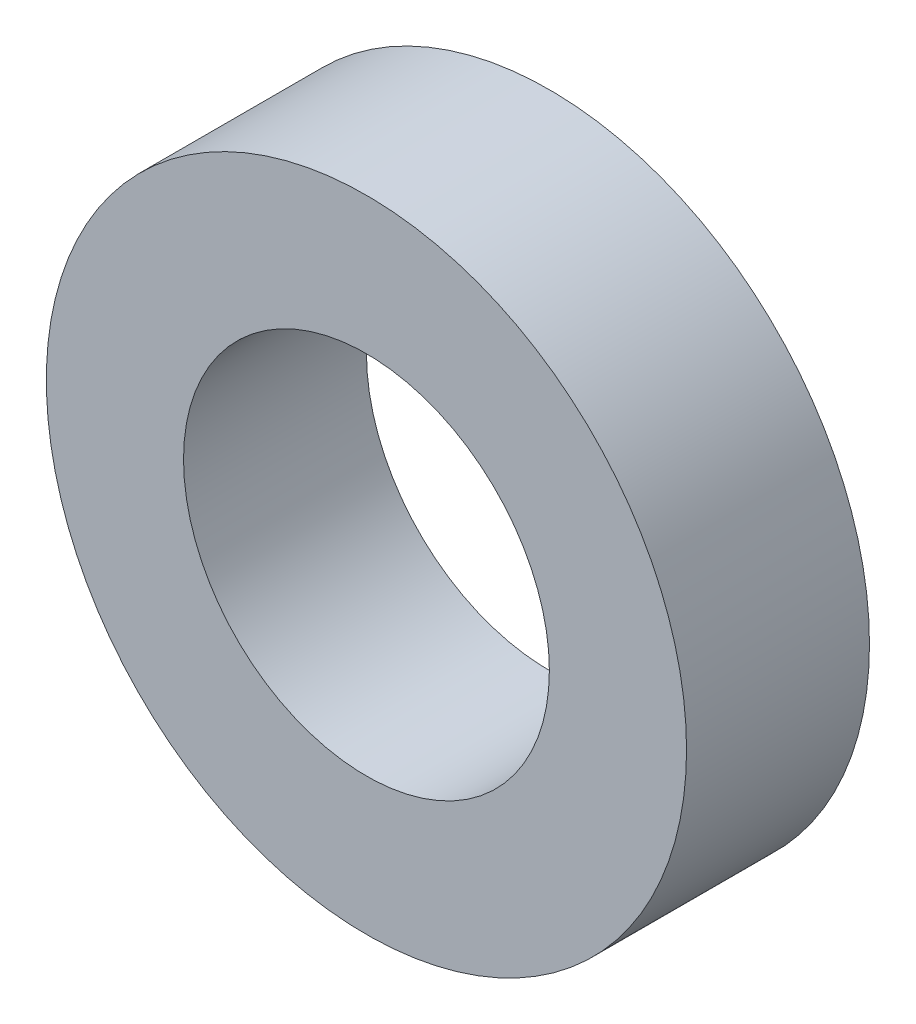
ISO-10303-21;
HEADER;
FILE_DESCRIPTION(('STEP AP214'),'2;1');
FILE_NAME('part.step','',(''),(''),'','','');
FILE_SCHEMA(('AUTOMOTIVE_DESIGN { 1 0 10303 214 1 1 1 1 }'));
ENDSEC;
DATA;
#1=APPLICATION_CONTEXT('core data for automotive mechanical design processes');
#2=APPLICATION_PROTOCOL_DEFINITION('international standard','automotive_design',2000,#1);
#3=PRODUCT_CONTEXT('',#1,'mechanical');
#4=PRODUCT('Part','Part','',(#3));
#5=PRODUCT_RELATED_PRODUCT_CATEGORY('part','',(#4));
#6=PRODUCT_DEFINITION_FORMATION('','',#4);
#7=PRODUCT_DEFINITION_CONTEXT('part definition',#1,'design');
#8=PRODUCT_DEFINITION('design','',#6,#7);
#9=PRODUCT_DEFINITION_SHAPE('','',#8);
#10=(LENGTH_UNIT() NAMED_UNIT(*) SI_UNIT(.MILLI.,.METRE.));
#11=(NAMED_UNIT(*) PLANE_ANGLE_UNIT() SI_UNIT($,.RADIAN.));
#12=(NAMED_UNIT(*) SI_UNIT($,.STERADIAN.) SOLID_ANGLE_UNIT());
#13=UNCERTAINTY_MEASURE_WITH_UNIT(LENGTH_MEASURE(1.E-05),#10,'distance_accuracy_value','');
#14=(GEOMETRIC_REPRESENTATION_CONTEXT(3) GLOBAL_UNCERTAINTY_ASSIGNED_CONTEXT((#13)) GLOBAL_UNIT_ASSIGNED_CONTEXT((#10,
#11,#12)) REPRESENTATION_CONTEXT('',''));
#15=CARTESIAN_POINT('',(0.,0.,0.));
#16=DIRECTION('',(0.,0.,1.));
#17=DIRECTION('',(1.,0.,0.));
#18=AXIS2_PLACEMENT_3D('',#15,#16,#17);
#19=CARTESIAN_POINT('',(0.,0.,3.175));
#20=DIRECTION('',(0.,0.,1.));
#21=DIRECTION('',(1.,0.,0.));
#22=AXIS2_PLACEMENT_3D('',#19,#20,#21);
#23=PLANE('',#22);
#24=CARTESIAN_POINT('',(0.,0.,3.175));
#25=DIRECTION('',(0.,0.,1.));
#26=DIRECTION('',(1.,0.,0.));
#27=AXIS2_PLACEMENT_3D('',#24,#25,#26);
#28=CIRCLE('',#27,11.1125);
#29=CARTESIAN_POINT('',(11.1125,0.,3.175));
#30=VERTEX_POINT('',#29);
#31=EDGE_CURVE('E10',#30,#30,#28,.T.);
#32=ORIENTED_EDGE('',*,*,#31,.T.);
#33=EDGE_LOOP('',(#32));
#34=FACE_BOUND('',#33,.T.);
#35=CARTESIAN_POINT('',(0.,0.,3.175));
#36=DIRECTION('',(0.,0.,1.));
#37=DIRECTION('',(1.,0.,0.));
#38=AXIS2_PLACEMENT_3D('',#35,#36,#37);
#39=CIRCLE('',#38,6.35);
#40=CARTESIAN_POINT('',(6.35,0.,3.175));
#41=VERTEX_POINT('',#40);
#42=EDGE_CURVE('E46',#41,#41,#39,.T.);
#43=ORIENTED_EDGE('',*,*,#42,.F.);
#44=EDGE_LOOP('',(#43));
#45=FACE_BOUND('',#44,.T.);
#46=ADVANCED_FACE('F35',(#34,#45),#23,.T.);
#47=CARTESIAN_POINT('',(0.,0.,-3.175));
#48=DIRECTION('',(0.,0.,1.));
#49=DIRECTION('',(1.,0.,0.));
#50=AXIS2_PLACEMENT_3D('',#47,#48,#49);
#51=PLANE('',#50);
#52=CARTESIAN_POINT('',(0.,0.,-3.175));
#53=DIRECTION('',(0.,0.,1.));
#54=DIRECTION('',(1.,0.,0.));
#55=AXIS2_PLACEMENT_3D('',#52,#53,#54);
#56=CIRCLE('',#55,11.1125);
#57=CARTESIAN_POINT('',(11.1125,0.,-3.175));
#58=VERTEX_POINT('',#57);
#59=EDGE_CURVE('E39',#58,#58,#56,.T.);
#60=ORIENTED_EDGE('',*,*,#59,.F.);
#61=EDGE_LOOP('',(#60));
#62=FACE_BOUND('',#61,.T.);
#63=CARTESIAN_POINT('',(0.,0.,-3.175));
#64=DIRECTION('',(0.,0.,1.));
#65=DIRECTION('',(1.,0.,0.));
#66=AXIS2_PLACEMENT_3D('',#63,#64,#65);
#67=CIRCLE('',#66,6.35);
#68=CARTESIAN_POINT('',(6.35,0.,-3.175));
#69=VERTEX_POINT('',#68);
#70=EDGE_CURVE('E48',#69,#69,#67,.T.);
#71=ORIENTED_EDGE('',*,*,#70,.T.);
#72=EDGE_LOOP('',(#71));
#73=FACE_BOUND('',#72,.T.);
#74=ADVANCED_FACE('F58',(#62,#73),#51,.F.);
#75=CARTESIAN_POINT('',(0.,0.,3.175));
#76=DIRECTION('',(0.,0.,-1.));
#77=DIRECTION('',(-1.,0.,0.));
#78=AXIS2_PLACEMENT_3D('',#75,#76,#77);
#79=CYLINDRICAL_SURFACE('',#78,11.1125);
#80=ORIENTED_EDGE('',*,*,#31,.F.);
#81=EDGE_LOOP('',(#80));
#82=FACE_BOUND('',#81,.T.);
#83=ORIENTED_EDGE('',*,*,#59,.T.);
#84=EDGE_LOOP('',(#83));
#85=FACE_BOUND('',#84,.T.);
#86=ADVANCED_FACE('F37',(#82,#85),#79,.T.);
#87=CARTESIAN_POINT('',(0.,0.,3.175));
#88=DIRECTION('',(0.,0.,-1.));
#89=DIRECTION('',(-1.,0.,0.));
#90=AXIS2_PLACEMENT_3D('',#87,#88,#89);
#91=CYLINDRICAL_SURFACE('',#90,6.35);
#92=ORIENTED_EDGE('',*,*,#42,.T.);
#93=EDGE_LOOP('',(#92));
#94=FACE_BOUND('',#93,.T.);
#95=ORIENTED_EDGE('',*,*,#70,.F.);
#96=EDGE_LOOP('',(#95));
#97=FACE_BOUND('',#96,.T.);
#98=ADVANCED_FACE('F54',(#94,#97),#91,.F.);
#99=CLOSED_SHELL('',(#46,#74,#86,#98));
#100=MANIFOLD_SOLID_BREP('B2',#99);
#101=ADVANCED_BREP_SHAPE_REPRESENTATION('',(#18,#100),#14);
#102=SHAPE_DEFINITION_REPRESENTATION(#9,#101);
ENDSEC;
END-ISO-10303-21;
